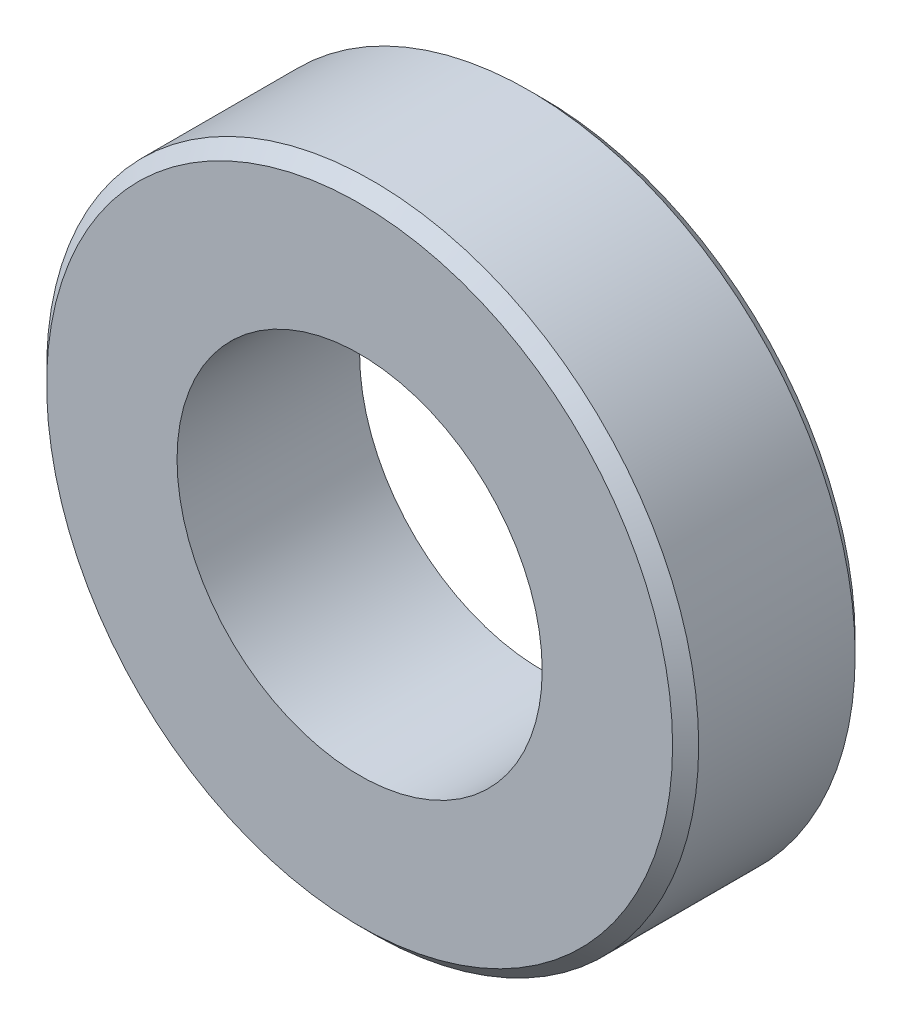
ISO-10303-21;
HEADER;
FILE_DESCRIPTION(('STEP AP214'),'2;1');
FILE_NAME('part.step','',(''),(''),'','','');
FILE_SCHEMA(('AUTOMOTIVE_DESIGN { 1 0 10303 214 1 1 1 1 }'));
ENDSEC;
DATA;
#1=APPLICATION_CONTEXT('core data for automotive mechanical design processes');
#2=APPLICATION_PROTOCOL_DEFINITION('international standard','automotive_design',2000,#1);
#3=PRODUCT_CONTEXT('',#1,'mechanical');
#4=PRODUCT('Part','Part','',(#3));
#5=PRODUCT_RELATED_PRODUCT_CATEGORY('part','',(#4));
#6=PRODUCT_DEFINITION_FORMATION('','',#4);
#7=PRODUCT_DEFINITION_CONTEXT('part definition',#1,'design');
#8=PRODUCT_DEFINITION('design','',#6,#7);
#9=PRODUCT_DEFINITION_SHAPE('','',#8);
#10=(LENGTH_UNIT() NAMED_UNIT(*) SI_UNIT(.MILLI.,.METRE.));
#11=(NAMED_UNIT(*) PLANE_ANGLE_UNIT() SI_UNIT($,.RADIAN.));
#12=(NAMED_UNIT(*) SI_UNIT($,.STERADIAN.) SOLID_ANGLE_UNIT());
#13=UNCERTAINTY_MEASURE_WITH_UNIT(LENGTH_MEASURE(1.E-05),#10,'distance_accuracy_value','');
#14=(GEOMETRIC_REPRESENTATION_CONTEXT(3) GLOBAL_UNCERTAINTY_ASSIGNED_CONTEXT((#13)) GLOBAL_UNIT_ASSIGNED_CONTEXT((#10,
#11,#12)) REPRESENTATION_CONTEXT('',''));
#15=CARTESIAN_POINT('',(0.,0.,0.));
#16=DIRECTION('',(0.,0.,1.));
#17=DIRECTION('',(1.,0.,0.));
#18=AXIS2_PLACEMENT_3D('',#15,#16,#17);
#19=CARTESIAN_POINT('',(0.,0.,7.));
#20=DIRECTION('',(0.,0.,1.));
#21=DIRECTION('',(1.,0.,0.));
#22=AXIS2_PLACEMENT_3D('',#19,#20,#21);
#23=PLANE('',#22);
#24=CARTESIAN_POINT('',(0.,0.,7.));
#25=DIRECTION('',(0.,0.,1.));
#26=DIRECTION('',(1.,0.,0.));
#27=AXIS2_PLACEMENT_3D('',#24,#25,#26);
#28=CIRCLE('',#27,12.);
#29=CARTESIAN_POINT('',(12.,0.,7.));
#30=VERTEX_POINT('',#29);
#31=EDGE_CURVE('E10',#30,#30,#28,.T.);
#32=ORIENTED_EDGE('',*,*,#31,.T.);
#33=EDGE_LOOP('',(#32));
#34=FACE_BOUND('',#33,.T.);
#35=CARTESIAN_POINT('',(0.,0.,7.));
#36=DIRECTION('',(0.,0.,1.));
#37=DIRECTION('',(1.,0.,0.));
#38=AXIS2_PLACEMENT_3D('',#35,#36,#37);
#39=CIRCLE('',#38,7.);
#40=CARTESIAN_POINT('',(7.,0.,7.));
#41=VERTEX_POINT('',#40);
#42=EDGE_CURVE('E50',#41,#41,#39,.T.);
#43=ORIENTED_EDGE('',*,*,#42,.F.);
#44=EDGE_LOOP('',(#43));
#45=FACE_BOUND('',#44,.T.);
#46=ADVANCED_FACE('F30',(#34,#45),#23,.T.);
#47=CARTESIAN_POINT('',(0.,0.,0.));
#48=DIRECTION('',(0.,0.,1.));
#49=DIRECTION('',(1.,0.,0.));
#50=AXIS2_PLACEMENT_3D('',#47,#48,#49);
#51=PLANE('',#50);
#52=CARTESIAN_POINT('',(0.,0.,0.));
#53=DIRECTION('',(0.,0.,1.));
#54=DIRECTION('',(1.,0.,0.));
#55=AXIS2_PLACEMENT_3D('',#52,#53,#54);
#56=CIRCLE('',#55,12.);
#57=CARTESIAN_POINT('',(12.,0.,0.));
#58=VERTEX_POINT('',#57);
#59=EDGE_CURVE('E37',#58,#58,#56,.F.);
#60=ORIENTED_EDGE('',*,*,#59,.T.);
#61=EDGE_LOOP('',(#60));
#62=FACE_BOUND('',#61,.T.);
#63=CARTESIAN_POINT('',(0.,0.,0.));
#64=DIRECTION('',(0.,0.,1.));
#65=DIRECTION('',(1.,0.,0.));
#66=AXIS2_PLACEMENT_3D('',#63,#64,#65);
#67=CIRCLE('',#66,7.);
#68=CARTESIAN_POINT('',(7.,0.,0.));
#69=VERTEX_POINT('',#68);
#70=EDGE_CURVE('E51',#69,#69,#67,.T.);
#71=ORIENTED_EDGE('',*,*,#70,.T.);
#72=EDGE_LOOP('',(#71));
#73=FACE_BOUND('',#72,.T.);
#74=ADVANCED_FACE('F61',(#62,#73),#51,.F.);
#75=CARTESIAN_POINT('',(0.,0.,7.));
#76=DIRECTION('',(0.,0.,-1.));
#77=DIRECTION('',(-1.,0.,0.));
#78=AXIS2_PLACEMENT_3D('',#75,#76,#77);
#79=CYLINDRICAL_SURFACE('',#78,12.5);
#80=CARTESIAN_POINT('',(0.,0.,0.500000000000007));
#81=DIRECTION('',(0.,0.,1.));
#82=DIRECTION('',(1.,0.,0.));
#83=AXIS2_PLACEMENT_3D('',#80,#81,#82);
#84=CIRCLE('',#83,12.5);
#85=CARTESIAN_POINT('',(12.5,0.,0.500000000000007));
#86=VERTEX_POINT('',#85);
#87=EDGE_CURVE('E41',#86,#86,#84,.T.);
#88=ORIENTED_EDGE('',*,*,#87,.T.);
#89=EDGE_LOOP('',(#88));
#90=FACE_BOUND('',#89,.T.);
#91=CARTESIAN_POINT('',(0.,0.,6.5));
#92=DIRECTION('',(0.,0.,1.));
#93=DIRECTION('',(1.,0.,0.));
#94=AXIS2_PLACEMENT_3D('',#91,#92,#93);
#95=CIRCLE('',#94,12.5);
#96=CARTESIAN_POINT('',(12.5,0.,6.5));
#97=VERTEX_POINT('',#96);
#98=EDGE_CURVE('E45',#97,#97,#95,.F.);
#99=ORIENTED_EDGE('',*,*,#98,.T.);
#100=EDGE_LOOP('',(#99));
#101=FACE_BOUND('',#100,.T.);
#102=ADVANCED_FACE('F66',(#90,#101),#79,.T.);
#103=CARTESIAN_POINT('',(0.,0.,7.));
#104=DIRECTION('',(0.,0.,-1.));
#105=DIRECTION('',(-1.,0.,0.));
#106=AXIS2_PLACEMENT_3D('',#103,#104,#105);
#107=CYLINDRICAL_SURFACE('',#106,7.);
#108=ORIENTED_EDGE('',*,*,#42,.T.);
#109=EDGE_LOOP('',(#108));
#110=FACE_BOUND('',#109,.T.);
#111=ORIENTED_EDGE('',*,*,#70,.F.);
#112=EDGE_LOOP('',(#111));
#113=FACE_BOUND('',#112,.T.);
#114=ADVANCED_FACE('F57',(#110,#113),#107,.F.);
#115=CARTESIAN_POINT('',(0.,0.,0.500000000000007));
#116=DIRECTION('',(0.,0.,1.));
#117=DIRECTION('',(1.,0.,0.));
#118=AXIS2_PLACEMENT_3D('',#115,#116,#117);
#119=CONICAL_SURFACE('',#118,12.5,0.78539816339745);
#120=ORIENTED_EDGE('',*,*,#59,.F.);
#121=EDGE_LOOP('',(#120));
#122=FACE_BOUND('',#121,.T.);
#123=ORIENTED_EDGE('',*,*,#87,.F.);
#124=EDGE_LOOP('',(#123));
#125=FACE_BOUND('',#124,.T.);
#126=ADVANCED_FACE('F72',(#122,#125),#119,.T.);
#127=CARTESIAN_POINT('',(0.,0.,7.));
#128=DIRECTION('',(0.,0.,-1.));
#129=DIRECTION('',(-1.,0.,0.));
#130=AXIS2_PLACEMENT_3D('',#127,#128,#129);
#131=CONICAL_SURFACE('',#130,12.,0.785398163397448);
#132=ORIENTED_EDGE('',*,*,#98,.F.);
#133=EDGE_LOOP('',(#132));
#134=FACE_BOUND('',#133,.T.);
#135=ORIENTED_EDGE('',*,*,#31,.F.);
#136=EDGE_LOOP('',(#135));
#137=FACE_BOUND('',#136,.T.);
#138=ADVANCED_FACE('F32',(#134,#137),#131,.T.);
#139=CLOSED_SHELL('',(#46,#74,#102,#114,#126,#138));
#140=MANIFOLD_SOLID_BREP('B2',#139);
#141=ADVANCED_BREP_SHAPE_REPRESENTATION('',(#18,#140),#14);
#142=SHAPE_DEFINITION_REPRESENTATION(#9,#141);
ENDSEC;
END-ISO-10303-21;
